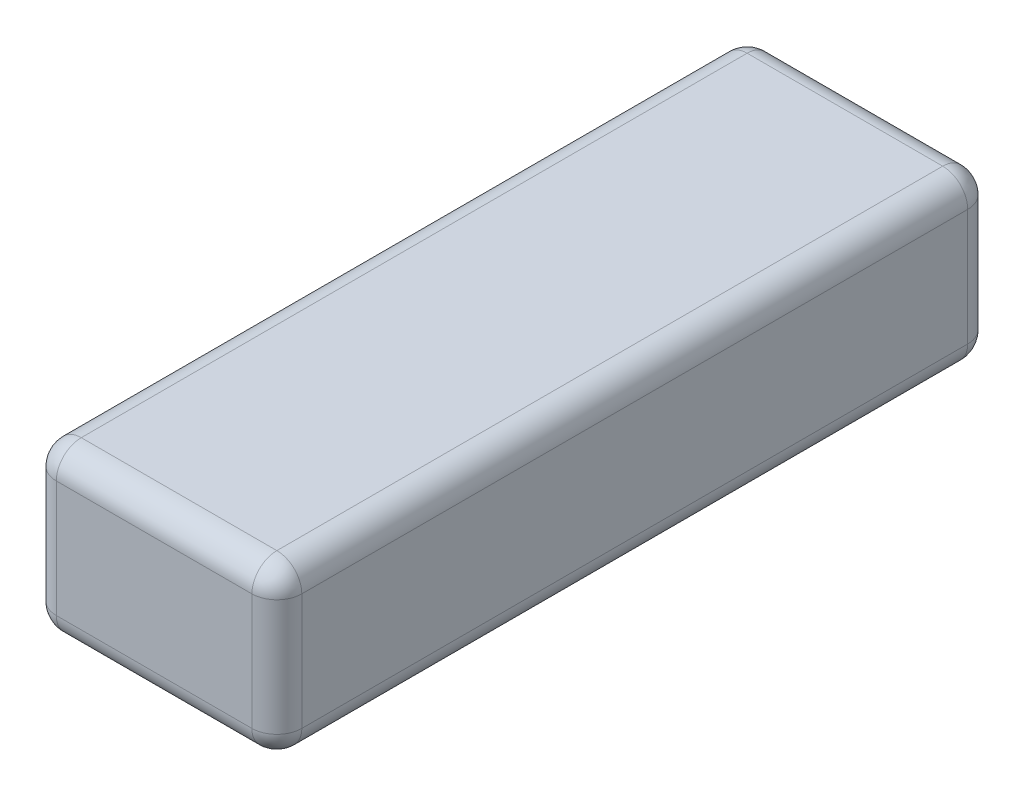
ISO-10303-21;
HEADER;
FILE_DESCRIPTION(('STEP AP214'),'2;1');
FILE_NAME('part.step','',(''),(''),'','','');
FILE_SCHEMA(('AUTOMOTIVE_DESIGN { 1 0 10303 214 1 1 1 1 }'));
ENDSEC;
DATA;
#1=APPLICATION_CONTEXT('core data for automotive mechanical design processes');
#2=APPLICATION_PROTOCOL_DEFINITION('international standard','automotive_design',2000,#1);
#3=PRODUCT_CONTEXT('',#1,'mechanical');
#4=PRODUCT('Part','Part','',(#3));
#5=PRODUCT_RELATED_PRODUCT_CATEGORY('part','',(#4));
#6=PRODUCT_DEFINITION_FORMATION('','',#4);
#7=PRODUCT_DEFINITION_CONTEXT('part definition',#1,'design');
#8=PRODUCT_DEFINITION('design','',#6,#7);
#9=PRODUCT_DEFINITION_SHAPE('','',#8);
#10=(LENGTH_UNIT() NAMED_UNIT(*) SI_UNIT(.MILLI.,.METRE.));
#11=(NAMED_UNIT(*) PLANE_ANGLE_UNIT() SI_UNIT($,.RADIAN.));
#12=(NAMED_UNIT(*) SI_UNIT($,.STERADIAN.) SOLID_ANGLE_UNIT());
#13=UNCERTAINTY_MEASURE_WITH_UNIT(LENGTH_MEASURE(1.E-05),#10,'distance_accuracy_value','');
#14=(GEOMETRIC_REPRESENTATION_CONTEXT(3) GLOBAL_UNCERTAINTY_ASSIGNED_CONTEXT((#13)) GLOBAL_UNIT_ASSIGNED_CONTEXT((#10,
#11,#12)) REPRESENTATION_CONTEXT('',''));
#15=CARTESIAN_POINT('',(0.,0.,0.));
#16=DIRECTION('',(0.,0.,1.));
#17=DIRECTION('',(1.,0.,0.));
#18=AXIS2_PLACEMENT_3D('',#15,#16,#17);
#19=CARTESIAN_POINT('',(14.75,10.,43.));
#20=DIRECTION('',(-1.,0.,0.));
#21=DIRECTION('',(0.,0.,1.));
#22=AXIS2_PLACEMENT_3D('',#19,#20,#21);
#23=PLANE('',#22);
#24=DIRECTION('',(0.,-1.,0.));
#25=VECTOR('',#24,1.);
#26=CARTESIAN_POINT('',(14.75,10.,-40.));
#27=LINE('',#26,#25);
#28=CARTESIAN_POINT('',(14.75,-7.,-40.));
#29=VERTEX_POINT('',#28);
#30=CARTESIAN_POINT('',(14.75,7.,-40.));
#31=VERTEX_POINT('',#30);
#32=EDGE_CURVE('E173',#29,#31,#27,.F.);
#33=ORIENTED_EDGE('',*,*,#32,.T.);
#34=DIRECTION('',(0.,0.,-1.));
#35=VECTOR('',#34,1.);
#36=CARTESIAN_POINT('',(14.75,7.,43.));
#37=LINE('',#36,#35);
#38=CARTESIAN_POINT('',(14.75,7.,40.));
#39=VERTEX_POINT('',#38);
#40=EDGE_CURVE('E175',#31,#39,#37,.F.);
#41=ORIENTED_EDGE('',*,*,#40,.T.);
#42=DIRECTION('',(0.,-1.,0.));
#43=VECTOR('',#42,1.);
#44=CARTESIAN_POINT('',(14.75,10.,40.));
#45=LINE('',#44,#43);
#46=CARTESIAN_POINT('',(14.75,-7.,40.));
#47=VERTEX_POINT('',#46);
#48=EDGE_CURVE('E169',#39,#47,#45,.T.);
#49=ORIENTED_EDGE('',*,*,#48,.T.);
#50=DIRECTION('',(0.,0.,-1.));
#51=VECTOR('',#50,1.);
#52=CARTESIAN_POINT('',(14.75,-7.,-43.));
#53=LINE('',#52,#51);
#54=EDGE_CURVE('E171',#47,#29,#53,.T.);
#55=ORIENTED_EDGE('',*,*,#54,.T.);
#56=EDGE_LOOP('',(#33,#41,#49,#55));
#57=FACE_BOUND('',#56,.T.);
#58=ADVANCED_FACE('F36',(#57),#23,.F.);
#59=CARTESIAN_POINT('',(-14.75,10.,-43.));
#60=DIRECTION('',(0.,0.,1.));
#61=DIRECTION('',(1.,0.,0.));
#62=AXIS2_PLACEMENT_3D('',#59,#60,#61);
#63=PLANE('',#62);
#64=DIRECTION('',(-1.,0.,0.));
#65=VECTOR('',#64,1.);
#66=CARTESIAN_POINT('',(-14.75,7.,-43.));
#67=LINE('',#66,#65);
#68=CARTESIAN_POINT('',(-11.75,7.,-43.));
#69=VERTEX_POINT('',#68);
#70=CARTESIAN_POINT('',(11.75,7.,-43.));
#71=VERTEX_POINT('',#70);
#72=EDGE_CURVE('E180',#69,#71,#67,.F.);
#73=ORIENTED_EDGE('',*,*,#72,.T.);
#74=DIRECTION('',(0.,-1.,0.));
#75=VECTOR('',#74,1.);
#76=CARTESIAN_POINT('',(11.75,10.,-43.));
#77=LINE('',#76,#75);
#78=CARTESIAN_POINT('',(11.75,-7.,-43.));
#79=VERTEX_POINT('',#78);
#80=EDGE_CURVE('E184',#71,#79,#77,.T.);
#81=ORIENTED_EDGE('',*,*,#80,.T.);
#82=DIRECTION('',(-1.,0.,0.));
#83=VECTOR('',#82,1.);
#84=CARTESIAN_POINT('',(-14.75,-7.,-43.));
#85=LINE('',#84,#83);
#86=CARTESIAN_POINT('',(-11.75,-7.,-43.));
#87=VERTEX_POINT('',#86);
#88=EDGE_CURVE('E182',#79,#87,#85,.T.);
#89=ORIENTED_EDGE('',*,*,#88,.T.);
#90=DIRECTION('',(0.,-1.,0.));
#91=VECTOR('',#90,1.);
#92=CARTESIAN_POINT('',(-11.75,10.,-43.));
#93=LINE('',#92,#91);
#94=EDGE_CURVE('E178',#87,#69,#93,.F.);
#95=ORIENTED_EDGE('',*,*,#94,.T.);
#96=EDGE_LOOP('',(#73,#81,#89,#95));
#97=FACE_BOUND('',#96,.T.);
#98=ADVANCED_FACE('F281',(#97),#63,.F.);
#99=CARTESIAN_POINT('',(-14.75,10.,43.));
#100=DIRECTION('',(1.,0.,0.));
#101=DIRECTION('',(0.,0.,-1.));
#102=AXIS2_PLACEMENT_3D('',#99,#100,#101);
#103=PLANE('',#102);
#104=DIRECTION('',(0.,0.,1.));
#105=VECTOR('',#104,1.);
#106=CARTESIAN_POINT('',(-14.75,7.,43.));
#107=LINE('',#106,#105);
#108=CARTESIAN_POINT('',(-14.75,7.,40.));
#109=VERTEX_POINT('',#108);
#110=CARTESIAN_POINT('',(-14.75,7.,-40.));
#111=VERTEX_POINT('',#110);
#112=EDGE_CURVE('E144',#109,#111,#107,.F.);
#113=ORIENTED_EDGE('',*,*,#112,.T.);
#114=DIRECTION('',(0.,-1.,0.));
#115=VECTOR('',#114,1.);
#116=CARTESIAN_POINT('',(-14.75,10.,-40.));
#117=LINE('',#116,#115);
#118=CARTESIAN_POINT('',(-14.75,-7.,-40.));
#119=VERTEX_POINT('',#118);
#120=EDGE_CURVE('E201',#111,#119,#117,.T.);
#121=ORIENTED_EDGE('',*,*,#120,.T.);
#122=DIRECTION('',(0.,0.,1.));
#123=VECTOR('',#122,1.);
#124=CARTESIAN_POINT('',(-14.75,-7.,43.));
#125=LINE('',#124,#123);
#126=CARTESIAN_POINT('',(-14.75,-7.,40.));
#127=VERTEX_POINT('',#126);
#128=EDGE_CURVE('E199',#119,#127,#125,.T.);
#129=ORIENTED_EDGE('',*,*,#128,.T.);
#130=DIRECTION('',(0.,-1.,0.));
#131=VECTOR('',#130,1.);
#132=CARTESIAN_POINT('',(-14.75,10.,40.));
#133=LINE('',#132,#131);
#134=EDGE_CURVE('E196',#127,#109,#133,.F.);
#135=ORIENTED_EDGE('',*,*,#134,.T.);
#136=EDGE_LOOP('',(#113,#121,#129,#135));
#137=FACE_BOUND('',#136,.T.);
#138=ADVANCED_FACE('F268',(#137),#103,.F.);
#139=CARTESIAN_POINT('',(-14.75,10.,43.));
#140=DIRECTION('',(0.,0.,-1.));
#141=DIRECTION('',(-1.,0.,0.));
#142=AXIS2_PLACEMENT_3D('',#139,#140,#141);
#143=PLANE('',#142);
#144=DIRECTION('',(1.,0.,0.));
#145=VECTOR('',#144,1.);
#146=CARTESIAN_POINT('',(-14.75,7.,43.));
#147=LINE('',#146,#145);
#148=CARTESIAN_POINT('',(11.75,7.,43.));
#149=VERTEX_POINT('',#148);
#150=CARTESIAN_POINT('',(-11.75,7.,43.));
#151=VERTEX_POINT('',#150);
#152=EDGE_CURVE('E59',#149,#151,#147,.F.);
#153=ORIENTED_EDGE('',*,*,#152,.T.);
#154=DIRECTION('',(0.,-1.,0.));
#155=VECTOR('',#154,1.);
#156=CARTESIAN_POINT('',(-11.75,10.,43.));
#157=LINE('',#156,#155);
#158=CARTESIAN_POINT('',(-11.75,-7.,43.));
#159=VERTEX_POINT('',#158);
#160=EDGE_CURVE('E11',#151,#159,#157,.T.);
#161=ORIENTED_EDGE('',*,*,#160,.T.);
#162=DIRECTION('',(1.,0.,0.));
#163=VECTOR('',#162,1.);
#164=CARTESIAN_POINT('',(14.75,-7.,43.));
#165=LINE('',#164,#163);
#166=CARTESIAN_POINT('',(11.75,-7.,43.));
#167=VERTEX_POINT('',#166);
#168=EDGE_CURVE('E45',#159,#167,#165,.T.);
#169=ORIENTED_EDGE('',*,*,#168,.T.);
#170=DIRECTION('',(0.,-1.,0.));
#171=VECTOR('',#170,1.);
#172=CARTESIAN_POINT('',(11.75,10.,43.));
#173=LINE('',#172,#171);
#174=EDGE_CURVE('E204',#167,#149,#173,.F.);
#175=ORIENTED_EDGE('',*,*,#174,.T.);
#176=EDGE_LOOP('',(#153,#161,#169,#175));
#177=FACE_BOUND('',#176,.T.);
#178=ADVANCED_FACE('F311',(#177),#143,.F.);
#179=CARTESIAN_POINT('',(0.,10.,0.));
#180=DIRECTION('',(0.,-1.,0.));
#181=DIRECTION('',(0.,0.,-1.));
#182=AXIS2_PLACEMENT_3D('',#179,#180,#181);
#183=PLANE('',#182);
#184=DIRECTION('',(1.,0.,0.));
#185=VECTOR('',#184,1.);
#186=CARTESIAN_POINT('',(0.,10.,40.));
#187=LINE('',#186,#185);
#188=CARTESIAN_POINT('',(-11.75,10.,40.));
#189=VERTEX_POINT('',#188);
#190=CARTESIAN_POINT('',(11.75,10.,40.));
#191=VERTEX_POINT('',#190);
#192=EDGE_CURVE('E131',#189,#191,#187,.T.);
#193=ORIENTED_EDGE('',*,*,#192,.T.);
#194=DIRECTION('',(0.,0.,-1.));
#195=VECTOR('',#194,1.);
#196=CARTESIAN_POINT('',(11.75,10.,0.));
#197=LINE('',#196,#195);
#198=CARTESIAN_POINT('',(11.75,10.,-40.));
#199=VERTEX_POINT('',#198);
#200=EDGE_CURVE('E167',#191,#199,#197,.T.);
#201=ORIENTED_EDGE('',*,*,#200,.T.);
#202=DIRECTION('',(-1.,0.,0.));
#203=VECTOR('',#202,1.);
#204=CARTESIAN_POINT('',(0.,10.,-40.));
#205=LINE('',#204,#203);
#206=CARTESIAN_POINT('',(-11.75,10.,-40.));
#207=VERTEX_POINT('',#206);
#208=EDGE_CURVE('E134',#199,#207,#205,.T.);
#209=ORIENTED_EDGE('',*,*,#208,.T.);
#210=DIRECTION('',(0.,0.,1.));
#211=VECTOR('',#210,1.);
#212=CARTESIAN_POINT('',(-11.75,10.,0.));
#213=LINE('',#212,#211);
#214=EDGE_CURVE('E126',#207,#189,#213,.T.);
#215=ORIENTED_EDGE('',*,*,#214,.T.);
#216=EDGE_LOOP('',(#193,#201,#209,#215));
#217=FACE_BOUND('',#216,.T.);
#218=ADVANCED_FACE('F128',(#217),#183,.F.);
#219=CARTESIAN_POINT('',(0.,-10.,0.));
#220=DIRECTION('',(0.,-1.,0.));
#221=DIRECTION('',(0.,0.,-1.));
#222=AXIS2_PLACEMENT_3D('',#219,#220,#221);
#223=PLANE('',#222);
#224=DIRECTION('',(-1.,0.,0.));
#225=VECTOR('',#224,1.);
#226=CARTESIAN_POINT('',(14.75,-10.,-40.));
#227=LINE('',#226,#225);
#228=CARTESIAN_POINT('',(-11.75,-10.,-40.));
#229=VERTEX_POINT('',#228);
#230=CARTESIAN_POINT('',(11.75,-10.,-40.));
#231=VERTEX_POINT('',#230);
#232=EDGE_CURVE('E191',#229,#231,#227,.F.);
#233=ORIENTED_EDGE('',*,*,#232,.T.);
#234=DIRECTION('',(0.,0.,-1.));
#235=VECTOR('',#234,1.);
#236=CARTESIAN_POINT('',(11.75,-10.,43.));
#237=LINE('',#236,#235);
#238=CARTESIAN_POINT('',(11.75,-10.,40.));
#239=VERTEX_POINT('',#238);
#240=EDGE_CURVE('E193',#231,#239,#237,.F.);
#241=ORIENTED_EDGE('',*,*,#240,.T.);
#242=DIRECTION('',(1.,0.,0.));
#243=VECTOR('',#242,1.);
#244=CARTESIAN_POINT('',(-14.75,-10.,40.));
#245=LINE('',#244,#243);
#246=CARTESIAN_POINT('',(-11.75,-10.,40.));
#247=VERTEX_POINT('',#246);
#248=EDGE_CURVE('E187',#239,#247,#245,.F.);
#249=ORIENTED_EDGE('',*,*,#248,.T.);
#250=DIRECTION('',(0.,0.,1.));
#251=VECTOR('',#250,1.);
#252=CARTESIAN_POINT('',(-11.75,-10.,-43.));
#253=LINE('',#252,#251);
#254=EDGE_CURVE('E189',#247,#229,#253,.F.);
#255=ORIENTED_EDGE('',*,*,#254,.T.);
#256=EDGE_LOOP('',(#233,#241,#249,#255));
#257=FACE_BOUND('',#256,.T.);
#258=ADVANCED_FACE('F297',(#257),#223,.T.);
#259=CARTESIAN_POINT('',(-11.75,-7.,43.));
#260=DIRECTION('',(0.,0.,-1.));
#261=DIRECTION('',(-1.,0.,0.));
#262=AXIS2_PLACEMENT_3D('',#259,#260,#261);
#263=CYLINDRICAL_SURFACE('',#262,3.);
#264=CARTESIAN_POINT('',(-11.75,-7.,40.));
#265=DIRECTION('',(0.,0.,1.));
#266=DIRECTION('',(1.,0.,0.));
#267=AXIS2_PLACEMENT_3D('',#264,#265,#266);
#268=CIRCLE('',#267,3.);
#269=EDGE_CURVE('E40',#127,#247,#268,.T.);
#270=ORIENTED_EDGE('',*,*,#269,.F.);
#271=ORIENTED_EDGE('',*,*,#128,.F.);
#272=CARTESIAN_POINT('',(-11.75,-7.,-40.));
#273=DIRECTION('',(0.,0.,-1.));
#274=DIRECTION('',(-1.,0.,0.));
#275=AXIS2_PLACEMENT_3D('',#272,#273,#274);
#276=CIRCLE('',#275,3.);
#277=EDGE_CURVE('E164',#229,#119,#276,.T.);
#278=ORIENTED_EDGE('',*,*,#277,.F.);
#279=ORIENTED_EDGE('',*,*,#254,.F.);
#280=EDGE_LOOP('',(#270,#271,#278,#279));
#281=FACE_BOUND('',#280,.T.);
#282=ADVANCED_FACE('F38',(#281),#263,.T.);
#283=CARTESIAN_POINT('',(-11.75,-7.,40.));
#284=DIRECTION('',(0.,0.,1.));
#285=DIRECTION('',(1.,0.,0.));
#286=AXIS2_PLACEMENT_3D('',#283,#284,#285);
#287=SPHERICAL_SURFACE('',#286,3.);
#288=CARTESIAN_POINT('',(-11.75,-7.,40.));
#289=DIRECTION('',(0.,-1.,0.));
#290=DIRECTION('',(0.,0.,-1.));
#291=AXIS2_PLACEMENT_3D('',#288,#289,#290);
#292=CIRCLE('',#291,3.);
#293=EDGE_CURVE('E249',#127,#159,#292,.F.);
#294=ORIENTED_EDGE('',*,*,#293,.F.);
#295=ORIENTED_EDGE('',*,*,#269,.T.);
#296=CARTESIAN_POINT('',(-11.75,-7.,40.));
#297=DIRECTION('',(-1.,0.,0.));
#298=DIRECTION('',(0.,0.,1.));
#299=AXIS2_PLACEMENT_3D('',#296,#297,#298);
#300=CIRCLE('',#299,3.);
#301=EDGE_CURVE('E252',#159,#247,#300,.F.);
#302=ORIENTED_EDGE('',*,*,#301,.F.);
#303=EDGE_LOOP('',(#294,#295,#302));
#304=FACE_BOUND('',#303,.T.);
#305=ADVANCED_FACE('F307',(#304),#287,.T.);
#306=CARTESIAN_POINT('',(-11.75,-7.,-40.));
#307=DIRECTION('',(0.,0.,1.));
#308=DIRECTION('',(1.,0.,0.));
#309=AXIS2_PLACEMENT_3D('',#306,#307,#308);
#310=SPHERICAL_SURFACE('',#309,3.);
#311=CARTESIAN_POINT('',(-11.75,-7.,-40.));
#312=DIRECTION('',(-1.,0.,0.));
#313=DIRECTION('',(0.,0.,1.));
#314=AXIS2_PLACEMENT_3D('',#311,#312,#313);
#315=CIRCLE('',#314,3.);
#316=EDGE_CURVE('E244',#229,#87,#315,.F.);
#317=ORIENTED_EDGE('',*,*,#316,.F.);
#318=ORIENTED_EDGE('',*,*,#277,.T.);
#319=CARTESIAN_POINT('',(-11.75,-7.,-40.));
#320=DIRECTION('',(0.,-1.,0.));
#321=DIRECTION('',(0.,0.,-1.));
#322=AXIS2_PLACEMENT_3D('',#319,#320,#321);
#323=CIRCLE('',#322,3.);
#324=EDGE_CURVE('E247',#87,#119,#323,.F.);
#325=ORIENTED_EDGE('',*,*,#324,.F.);
#326=EDGE_LOOP('',(#317,#318,#325));
#327=FACE_BOUND('',#326,.T.);
#328=ADVANCED_FACE('F259',(#327),#310,.T.);
#329=CARTESIAN_POINT('',(-14.75,-7.,40.));
#330=DIRECTION('',(-1.,0.,0.));
#331=DIRECTION('',(0.,0.,1.));
#332=AXIS2_PLACEMENT_3D('',#329,#330,#331);
#333=CYLINDRICAL_SURFACE('',#332,3.);
#334=ORIENTED_EDGE('',*,*,#301,.T.);
#335=ORIENTED_EDGE('',*,*,#248,.F.);
#336=CARTESIAN_POINT('',(11.75,-7.,40.));
#337=DIRECTION('',(1.,0.,0.));
#338=DIRECTION('',(0.,0.,-1.));
#339=AXIS2_PLACEMENT_3D('',#336,#337,#338);
#340=CIRCLE('',#339,3.);
#341=EDGE_CURVE('E239',#167,#239,#340,.T.);
#342=ORIENTED_EDGE('',*,*,#341,.F.);
#343=ORIENTED_EDGE('',*,*,#168,.F.);
#344=EDGE_LOOP('',(#334,#335,#342,#343));
#345=FACE_BOUND('',#344,.T.);
#346=ADVANCED_FACE('F305',(#345),#333,.T.);
#347=CARTESIAN_POINT('',(-11.75,10.,40.));
#348=DIRECTION('',(0.,-1.,0.));
#349=DIRECTION('',(0.,0.,-1.));
#350=AXIS2_PLACEMENT_3D('',#347,#348,#349);
#351=CYLINDRICAL_SURFACE('',#350,3.);
#352=ORIENTED_EDGE('',*,*,#293,.T.);
#353=ORIENTED_EDGE('',*,*,#160,.F.);
#354=CARTESIAN_POINT('',(-11.75,7.,40.));
#355=DIRECTION('',(0.,1.,0.));
#356=DIRECTION('',(0.,0.,1.));
#357=AXIS2_PLACEMENT_3D('',#354,#355,#356);
#358=CIRCLE('',#357,3.);
#359=EDGE_CURVE('E148',#109,#151,#358,.T.);
#360=ORIENTED_EDGE('',*,*,#359,.F.);
#361=ORIENTED_EDGE('',*,*,#134,.F.);
#362=EDGE_LOOP('',(#352,#353,#360,#361));
#363=FACE_BOUND('',#362,.T.);
#364=ADVANCED_FACE('F310',(#363),#351,.T.);
#365=CARTESIAN_POINT('',(-11.75,7.,0.));
#366=DIRECTION('',(0.,0.,1.));
#367=DIRECTION('',(1.,0.,0.));
#368=AXIS2_PLACEMENT_3D('',#365,#366,#367);
#369=CYLINDRICAL_SURFACE('',#368,3.);
#370=CARTESIAN_POINT('',(-11.75,7.,-40.));
#371=DIRECTION('',(0.,0.,-1.));
#372=DIRECTION('',(-1.,0.,0.));
#373=AXIS2_PLACEMENT_3D('',#370,#371,#372);
#374=CIRCLE('',#373,3.);
#375=EDGE_CURVE('E149',#111,#207,#374,.T.);
#376=ORIENTED_EDGE('',*,*,#375,.F.);
#377=ORIENTED_EDGE('',*,*,#112,.F.);
#378=CARTESIAN_POINT('',(-11.75,7.,40.));
#379=DIRECTION('',(0.,0.,1.));
#380=DIRECTION('',(1.,0.,0.));
#381=AXIS2_PLACEMENT_3D('',#378,#379,#380);
#382=CIRCLE('',#381,3.);
#383=EDGE_CURVE('E141',#189,#109,#382,.T.);
#384=ORIENTED_EDGE('',*,*,#383,.F.);
#385=ORIENTED_EDGE('',*,*,#214,.F.);
#386=EDGE_LOOP('',(#376,#377,#384,#385));
#387=FACE_BOUND('',#386,.T.);
#388=ADVANCED_FACE('F143',(#387),#369,.T.);
#389=CARTESIAN_POINT('',(-11.75,10.,-40.));
#390=DIRECTION('',(0.,-1.,0.));
#391=DIRECTION('',(0.,0.,-1.));
#392=AXIS2_PLACEMENT_3D('',#389,#390,#391);
#393=CYLINDRICAL_SURFACE('',#392,3.);
#394=ORIENTED_EDGE('',*,*,#324,.T.);
#395=ORIENTED_EDGE('',*,*,#120,.F.);
#396=CARTESIAN_POINT('',(-11.75,7.,-40.));
#397=DIRECTION('',(0.,1.,0.));
#398=DIRECTION('',(0.,0.,1.));
#399=AXIS2_PLACEMENT_3D('',#396,#397,#398);
#400=CIRCLE('',#399,3.);
#401=EDGE_CURVE('E234',#69,#111,#400,.T.);
#402=ORIENTED_EDGE('',*,*,#401,.F.);
#403=ORIENTED_EDGE('',*,*,#94,.F.);
#404=EDGE_LOOP('',(#394,#395,#402,#403));
#405=FACE_BOUND('',#404,.T.);
#406=ADVANCED_FACE('F271',(#405),#393,.T.);
#407=CARTESIAN_POINT('',(-14.75,-7.,-40.));
#408=DIRECTION('',(1.,0.,0.));
#409=DIRECTION('',(0.,0.,-1.));
#410=AXIS2_PLACEMENT_3D('',#407,#408,#409);
#411=CYLINDRICAL_SURFACE('',#410,3.);
#412=ORIENTED_EDGE('',*,*,#316,.T.);
#413=ORIENTED_EDGE('',*,*,#88,.F.);
#414=CARTESIAN_POINT('',(11.75,-7.,-40.));
#415=DIRECTION('',(1.,0.,0.));
#416=DIRECTION('',(0.,0.,-1.));
#417=AXIS2_PLACEMENT_3D('',#414,#415,#416);
#418=CIRCLE('',#417,3.);
#419=EDGE_CURVE('E231',#231,#79,#418,.T.);
#420=ORIENTED_EDGE('',*,*,#419,.F.);
#421=ORIENTED_EDGE('',*,*,#232,.F.);
#422=EDGE_LOOP('',(#412,#413,#420,#421));
#423=FACE_BOUND('',#422,.T.);
#424=ADVANCED_FACE('F294',(#423),#411,.T.);
#425=CARTESIAN_POINT('',(11.75,-7.,43.));
#426=DIRECTION('',(0.,0.,1.));
#427=DIRECTION('',(1.,0.,0.));
#428=AXIS2_PLACEMENT_3D('',#425,#426,#427);
#429=CYLINDRICAL_SURFACE('',#428,3.);
#430=CARTESIAN_POINT('',(11.75,-7.,40.));
#431=DIRECTION('',(0.,0.,1.));
#432=DIRECTION('',(1.,0.,0.));
#433=AXIS2_PLACEMENT_3D('',#430,#431,#432);
#434=CIRCLE('',#433,3.);
#435=EDGE_CURVE('E241',#239,#47,#434,.T.);
#436=ORIENTED_EDGE('',*,*,#435,.F.);
#437=ORIENTED_EDGE('',*,*,#240,.F.);
#438=CARTESIAN_POINT('',(11.75,-7.,-40.));
#439=DIRECTION('',(0.,0.,-1.));
#440=DIRECTION('',(-1.,0.,0.));
#441=AXIS2_PLACEMENT_3D('',#438,#439,#440);
#442=CIRCLE('',#441,3.);
#443=EDGE_CURVE('E228',#29,#231,#442,.T.);
#444=ORIENTED_EDGE('',*,*,#443,.F.);
#445=ORIENTED_EDGE('',*,*,#54,.F.);
#446=EDGE_LOOP('',(#436,#437,#444,#445));
#447=FACE_BOUND('',#446,.T.);
#448=ADVANCED_FACE('F300',(#447),#429,.T.);
#449=CARTESIAN_POINT('',(11.75,-7.,40.));
#450=DIRECTION('',(0.,0.,1.));
#451=DIRECTION('',(1.,0.,0.));
#452=AXIS2_PLACEMENT_3D('',#449,#450,#451);
#453=SPHERICAL_SURFACE('',#452,3.);
#454=ORIENTED_EDGE('',*,*,#341,.T.);
#455=ORIENTED_EDGE('',*,*,#435,.T.);
#456=CARTESIAN_POINT('',(11.75,-7.,40.));
#457=DIRECTION('',(0.,-1.,0.));
#458=DIRECTION('',(0.,0.,-1.));
#459=AXIS2_PLACEMENT_3D('',#456,#457,#458);
#460=CIRCLE('',#459,3.);
#461=EDGE_CURVE('E155',#167,#47,#460,.F.);
#462=ORIENTED_EDGE('',*,*,#461,.F.);
#463=EDGE_LOOP('',(#454,#455,#462));
#464=FACE_BOUND('',#463,.T.);
#465=ADVANCED_FACE('F408',(#464),#453,.T.);
#466=CARTESIAN_POINT('',(-11.75,7.,40.));
#467=DIRECTION('',(0.,0.,1.));
#468=DIRECTION('',(1.,0.,0.));
#469=AXIS2_PLACEMENT_3D('',#466,#467,#468);
#470=SPHERICAL_SURFACE('',#469,3.);
#471=ORIENTED_EDGE('',*,*,#383,.T.);
#472=ORIENTED_EDGE('',*,*,#359,.T.);
#473=CARTESIAN_POINT('',(-11.75,7.,40.));
#474=DIRECTION('',(-1.,0.,0.));
#475=DIRECTION('',(0.,0.,1.));
#476=AXIS2_PLACEMENT_3D('',#473,#474,#475);
#477=CIRCLE('',#476,3.);
#478=EDGE_CURVE('E152',#189,#151,#477,.F.);
#479=ORIENTED_EDGE('',*,*,#478,.F.);
#480=EDGE_LOOP('',(#471,#472,#479));
#481=FACE_BOUND('',#480,.T.);
#482=ADVANCED_FACE('F153',(#481),#470,.T.);
#483=CARTESIAN_POINT('',(-11.75,7.,-40.));
#484=DIRECTION('',(0.,0.,1.));
#485=DIRECTION('',(1.,0.,0.));
#486=AXIS2_PLACEMENT_3D('',#483,#484,#485);
#487=SPHERICAL_SURFACE('',#486,3.);
#488=ORIENTED_EDGE('',*,*,#401,.T.);
#489=ORIENTED_EDGE('',*,*,#375,.T.);
#490=CARTESIAN_POINT('',(-11.75,7.,-40.));
#491=DIRECTION('',(-1.,0.,0.));
#492=DIRECTION('',(0.,0.,1.));
#493=AXIS2_PLACEMENT_3D('',#490,#491,#492);
#494=CIRCLE('',#493,3.);
#495=EDGE_CURVE('E156',#69,#207,#494,.F.);
#496=ORIENTED_EDGE('',*,*,#495,.F.);
#497=EDGE_LOOP('',(#488,#489,#496));
#498=FACE_BOUND('',#497,.T.);
#499=ADVANCED_FACE('F274',(#498),#487,.T.);
#500=CARTESIAN_POINT('',(11.75,-7.,-40.));
#501=DIRECTION('',(0.,0.,1.));
#502=DIRECTION('',(1.,0.,0.));
#503=AXIS2_PLACEMENT_3D('',#500,#501,#502);
#504=SPHERICAL_SURFACE('',#503,3.);
#505=ORIENTED_EDGE('',*,*,#443,.T.);
#506=ORIENTED_EDGE('',*,*,#419,.T.);
#507=CARTESIAN_POINT('',(11.75,-7.,-40.));
#508=DIRECTION('',(0.,-1.,0.));
#509=DIRECTION('',(0.,0.,-1.));
#510=AXIS2_PLACEMENT_3D('',#507,#508,#509);
#511=CIRCLE('',#510,3.);
#512=EDGE_CURVE('E222',#29,#79,#511,.F.);
#513=ORIENTED_EDGE('',*,*,#512,.F.);
#514=EDGE_LOOP('',(#505,#506,#513));
#515=FACE_BOUND('',#514,.T.);
#516=ADVANCED_FACE('F291',(#515),#504,.T.);
#517=CARTESIAN_POINT('',(11.75,10.,40.));
#518=DIRECTION('',(0.,-1.,0.));
#519=DIRECTION('',(0.,0.,-1.));
#520=AXIS2_PLACEMENT_3D('',#517,#518,#519);
#521=CYLINDRICAL_SURFACE('',#520,3.);
#522=ORIENTED_EDGE('',*,*,#461,.T.);
#523=ORIENTED_EDGE('',*,*,#48,.F.);
#524=CARTESIAN_POINT('',(11.75,7.,40.));
#525=DIRECTION('',(0.,1.,0.));
#526=DIRECTION('',(0.,0.,1.));
#527=AXIS2_PLACEMENT_3D('',#524,#525,#526);
#528=CIRCLE('',#527,3.);
#529=EDGE_CURVE('E219',#149,#39,#528,.T.);
#530=ORIENTED_EDGE('',*,*,#529,.F.);
#531=ORIENTED_EDGE('',*,*,#174,.F.);
#532=EDGE_LOOP('',(#522,#523,#530,#531));
#533=FACE_BOUND('',#532,.T.);
#534=ADVANCED_FACE('F316',(#533),#521,.T.);
#535=CARTESIAN_POINT('',(0.,7.,40.));
#536=DIRECTION('',(1.,0.,0.));
#537=DIRECTION('',(0.,0.,-1.));
#538=AXIS2_PLACEMENT_3D('',#535,#536,#537);
#539=CYLINDRICAL_SURFACE('',#538,3.);
#540=ORIENTED_EDGE('',*,*,#478,.T.);
#541=ORIENTED_EDGE('',*,*,#152,.F.);
#542=CARTESIAN_POINT('',(11.75,7.,40.));
#543=DIRECTION('',(1.,0.,0.));
#544=DIRECTION('',(0.,0.,-1.));
#545=AXIS2_PLACEMENT_3D('',#542,#543,#544);
#546=CIRCLE('',#545,3.);
#547=EDGE_CURVE('E160',#191,#149,#546,.T.);
#548=ORIENTED_EDGE('',*,*,#547,.F.);
#549=ORIENTED_EDGE('',*,*,#192,.F.);
#550=EDGE_LOOP('',(#540,#541,#548,#549));
#551=FACE_BOUND('',#550,.T.);
#552=ADVANCED_FACE('F158',(#551),#539,.T.);
#553=CARTESIAN_POINT('',(0.,7.,-40.));
#554=DIRECTION('',(-1.,0.,0.));
#555=DIRECTION('',(0.,0.,1.));
#556=AXIS2_PLACEMENT_3D('',#553,#554,#555);
#557=CYLINDRICAL_SURFACE('',#556,3.);
#558=ORIENTED_EDGE('',*,*,#495,.T.);
#559=ORIENTED_EDGE('',*,*,#208,.F.);
#560=CARTESIAN_POINT('',(11.75,7.,-40.));
#561=DIRECTION('',(1.,0.,0.));
#562=DIRECTION('',(0.,1.,0.));
#563=AXIS2_PLACEMENT_3D('',#560,#561,#562);
#564=CIRCLE('',#563,3.);
#565=EDGE_CURVE('E215',#71,#199,#564,.T.);
#566=ORIENTED_EDGE('',*,*,#565,.F.);
#567=ORIENTED_EDGE('',*,*,#72,.F.);
#568=EDGE_LOOP('',(#558,#559,#566,#567));
#569=FACE_BOUND('',#568,.T.);
#570=ADVANCED_FACE('F278',(#569),#557,.T.);
#571=CARTESIAN_POINT('',(11.75,10.,-40.));
#572=DIRECTION('',(0.,-1.,0.));
#573=DIRECTION('',(0.,0.,-1.));
#574=AXIS2_PLACEMENT_3D('',#571,#572,#573);
#575=CYLINDRICAL_SURFACE('',#574,3.);
#576=ORIENTED_EDGE('',*,*,#512,.T.);
#577=ORIENTED_EDGE('',*,*,#80,.F.);
#578=CARTESIAN_POINT('',(11.75,7.,-40.));
#579=DIRECTION('',(0.,1.,0.));
#580=DIRECTION('',(0.,0.,1.));
#581=AXIS2_PLACEMENT_3D('',#578,#579,#580);
#582=CIRCLE('',#581,3.);
#583=EDGE_CURVE('E212',#31,#71,#582,.T.);
#584=ORIENTED_EDGE('',*,*,#583,.F.);
#585=ORIENTED_EDGE('',*,*,#32,.F.);
#586=EDGE_LOOP('',(#576,#577,#584,#585));
#587=FACE_BOUND('',#586,.T.);
#588=ADVANCED_FACE('F284',(#587),#575,.T.);
#589=CARTESIAN_POINT('',(11.75,7.,40.));
#590=DIRECTION('',(0.,0.,1.));
#591=DIRECTION('',(1.,0.,0.));
#592=AXIS2_PLACEMENT_3D('',#589,#590,#591);
#593=SPHERICAL_SURFACE('',#592,3.);
#594=ORIENTED_EDGE('',*,*,#547,.T.);
#595=ORIENTED_EDGE('',*,*,#529,.T.);
#596=CARTESIAN_POINT('',(11.75,7.,40.));
#597=DIRECTION('',(0.,0.,1.));
#598=DIRECTION('',(1.,0.,0.));
#599=AXIS2_PLACEMENT_3D('',#596,#597,#598);
#600=CIRCLE('',#599,3.);
#601=EDGE_CURVE('E210',#191,#39,#600,.F.);
#602=ORIENTED_EDGE('',*,*,#601,.F.);
#603=EDGE_LOOP('',(#594,#595,#602));
#604=FACE_BOUND('',#603,.T.);
#605=ADVANCED_FACE('F318',(#604),#593,.T.);
#606=CARTESIAN_POINT('',(11.75,7.,-40.));
#607=DIRECTION('',(0.,0.,1.));
#608=DIRECTION('',(1.,0.,0.));
#609=AXIS2_PLACEMENT_3D('',#606,#607,#608);
#610=SPHERICAL_SURFACE('',#609,3.);
#611=ORIENTED_EDGE('',*,*,#583,.T.);
#612=ORIENTED_EDGE('',*,*,#565,.T.);
#613=CARTESIAN_POINT('',(11.75,7.,-40.));
#614=DIRECTION('',(0.,0.,-1.));
#615=DIRECTION('',(-1.,0.,0.));
#616=AXIS2_PLACEMENT_3D('',#613,#614,#615);
#617=CIRCLE('',#616,3.);
#618=EDGE_CURVE('E208',#31,#199,#617,.F.);
#619=ORIENTED_EDGE('',*,*,#618,.F.);
#620=EDGE_LOOP('',(#611,#612,#619));
#621=FACE_BOUND('',#620,.T.);
#622=ADVANCED_FACE('F324',(#621),#610,.T.);
#623=CARTESIAN_POINT('',(11.75,7.,0.));
#624=DIRECTION('',(0.,0.,-1.));
#625=DIRECTION('',(-1.,0.,0.));
#626=AXIS2_PLACEMENT_3D('',#623,#624,#625);
#627=CYLINDRICAL_SURFACE('',#626,3.);
#628=ORIENTED_EDGE('',*,*,#601,.T.);
#629=ORIENTED_EDGE('',*,*,#40,.F.);
#630=ORIENTED_EDGE('',*,*,#618,.T.);
#631=ORIENTED_EDGE('',*,*,#200,.F.);
#632=EDGE_LOOP('',(#628,#629,#630,#631));
#633=FACE_BOUND('',#632,.T.);
#634=ADVANCED_FACE('F321',(#633),#627,.T.);
#635=CLOSED_SHELL('',(#58,#98,#138,#178,#218,#258,#282,#305,#328,#346,#364,#388,#406,#424,#448,
#465,#482,#499,#516,#534,#552,#570,#588,#605,#622,#634));
#636=MANIFOLD_SOLID_BREP('B2',#635);
#637=ADVANCED_BREP_SHAPE_REPRESENTATION('',(#18,#636),#14);
#638=SHAPE_DEFINITION_REPRESENTATION(#9,#637);
ENDSEC;
END-ISO-10303-21;
